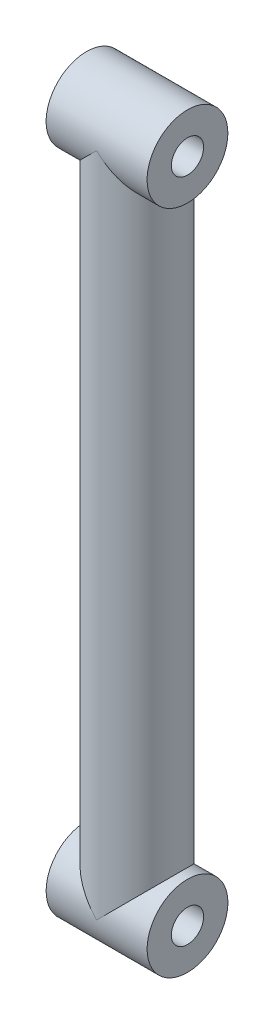
ISO-10303-21;
HEADER;
FILE_DESCRIPTION(('STEP AP214'),'2;1');
FILE_NAME('part.step','',(''),(''),'','','');
FILE_SCHEMA(('AUTOMOTIVE_DESIGN { 1 0 10303 214 1 1 1 1 }'));
ENDSEC;
DATA;
#1=APPLICATION_CONTEXT('core data for automotive mechanical design processes');
#2=APPLICATION_PROTOCOL_DEFINITION('international standard','automotive_design',2000,#1);
#3=PRODUCT_CONTEXT('',#1,'mechanical');
#4=PRODUCT('Part','Part','',(#3));
#5=PRODUCT_RELATED_PRODUCT_CATEGORY('part','',(#4));
#6=PRODUCT_DEFINITION_FORMATION('','',#4);
#7=PRODUCT_DEFINITION_CONTEXT('part definition',#1,'design');
#8=PRODUCT_DEFINITION('design','',#6,#7);
#9=PRODUCT_DEFINITION_SHAPE('','',#8);
#10=(LENGTH_UNIT() NAMED_UNIT(*) SI_UNIT(.MILLI.,.METRE.));
#11=(NAMED_UNIT(*) PLANE_ANGLE_UNIT() SI_UNIT($,.RADIAN.));
#12=(NAMED_UNIT(*) SI_UNIT($,.STERADIAN.) SOLID_ANGLE_UNIT());
#13=UNCERTAINTY_MEASURE_WITH_UNIT(LENGTH_MEASURE(1.E-05),#10,'distance_accuracy_value','');
#14=(GEOMETRIC_REPRESENTATION_CONTEXT(3) GLOBAL_UNCERTAINTY_ASSIGNED_CONTEXT((#13)) GLOBAL_UNIT_ASSIGNED_CONTEXT((#10,
#11,#12)) REPRESENTATION_CONTEXT('',''));
#15=CARTESIAN_POINT('',(0.,0.,0.));
#16=DIRECTION('',(0.,0.,1.));
#17=DIRECTION('',(1.,0.,0.));
#18=AXIS2_PLACEMENT_3D('',#15,#16,#17);
#19=CARTESIAN_POINT('',(0.,165.,0.));
#20=DIRECTION('',(0.,-1.,0.));
#21=DIRECTION('',(0.,0.,-1.));
#22=AXIS2_PLACEMENT_3D('',#19,#20,#21);
#23=CYLINDRICAL_SURFACE('',#22,10.);
#24=CARTESIAN_POINT('',(0.,165.,0.));
#25=DIRECTION('',(-0.707106781186547,-0.707106781186547,0.));
#26=DIRECTION('',(0.707106781186547,-0.707106781186547,0.));
#27=AXIS2_PLACEMENT_3D('',#24,#25,#26);
#28=ELLIPSE('',#27,14.1421356237308,9.99999999999988);
#29=CARTESIAN_POINT('',(0.,165.,-9.99999999999977));
#30=VERTEX_POINT('',#29);
#31=CARTESIAN_POINT('',(0.,165.,9.99999999999977));
#32=VERTEX_POINT('',#31);
#33=EDGE_CURVE('E51',#30,#32,#28,.T.);
#34=ORIENTED_EDGE('',*,*,#33,.T.);
#35=CARTESIAN_POINT('',(0.,165.,0.));
#36=DIRECTION('',(0.707106781186547,-0.707106781186547,0.));
#37=DIRECTION('',(-0.707106781186547,-0.707106781186547,0.));
#38=AXIS2_PLACEMENT_3D('',#35,#36,#37);
#39=ELLIPSE('',#38,14.1421356237308,9.99999999999988);
#40=EDGE_CURVE('E11',#32,#30,#39,.T.);
#41=ORIENTED_EDGE('',*,*,#40,.T.);
#42=EDGE_LOOP('',(#34,#41));
#43=FACE_BOUND('',#42,.T.);
#44=CARTESIAN_POINT('',(0.,0.,0.));
#45=DIRECTION('',(-0.707106781186547,-0.707106781186547,0.));
#46=DIRECTION('',(0.707106781186547,-0.707106781186547,0.));
#47=AXIS2_PLACEMENT_3D('',#44,#45,#46);
#48=ELLIPSE('',#47,14.1421356237308,9.99999999999989);
#49=CARTESIAN_POINT('',(0.,0.,-9.99999999999978));
#50=VERTEX_POINT('',#49);
#51=CARTESIAN_POINT('',(0.,0.,9.99999999999978));
#52=VERTEX_POINT('',#51);
#53=EDGE_CURVE('E67',#50,#52,#48,.F.);
#54=ORIENTED_EDGE('',*,*,#53,.T.);
#55=CARTESIAN_POINT('',(0.,0.,0.));
#56=DIRECTION('',(0.707106781186547,-0.707106781186547,0.));
#57=DIRECTION('',(-0.707106781186547,-0.707106781186547,0.));
#58=AXIS2_PLACEMENT_3D('',#55,#56,#57);
#59=ELLIPSE('',#58,14.1421356237308,9.99999999999989);
#60=EDGE_CURVE('E57',#52,#50,#59,.F.);
#61=ORIENTED_EDGE('',*,*,#60,.T.);
#62=EDGE_LOOP('',(#54,#61));
#63=FACE_BOUND('',#62,.T.);
#64=ADVANCED_FACE('F43',(#43,#63),#23,.T.);
#65=CARTESIAN_POINT('',(-12.5,165.,0.));
#66=DIRECTION('',(1.,0.,0.));
#67=DIRECTION('',(0.,0.,-1.));
#68=AXIS2_PLACEMENT_3D('',#65,#66,#67);
#69=CYLINDRICAL_SURFACE('',#68,9.99999999999977);
#70=CARTESIAN_POINT('',(12.5,165.,0.));
#71=DIRECTION('',(1.,0.,0.));
#72=DIRECTION('',(0.,0.,-1.));
#73=AXIS2_PLACEMENT_3D('',#70,#71,#72);
#74=CIRCLE('',#73,9.99999999999977);
#75=CARTESIAN_POINT('',(12.5,165.,-9.99999999999977));
#76=VERTEX_POINT('',#75);
#77=EDGE_CURVE('E78',#76,#76,#74,.T.);
#78=ORIENTED_EDGE('',*,*,#77,.F.);
#79=EDGE_LOOP('',(#78));
#80=FACE_BOUND('',#79,.T.);
#81=CARTESIAN_POINT('',(-12.5,165.,0.));
#82=DIRECTION('',(1.,0.,0.));
#83=DIRECTION('',(0.,0.,-1.));
#84=AXIS2_PLACEMENT_3D('',#81,#82,#83);
#85=CIRCLE('',#84,9.99999999999977);
#86=CARTESIAN_POINT('',(-12.5,165.,-9.99999999999977));
#87=VERTEX_POINT('',#86);
#88=EDGE_CURVE('E89',#87,#87,#85,.T.);
#89=ORIENTED_EDGE('',*,*,#88,.T.);
#90=EDGE_LOOP('',(#89));
#91=FACE_BOUND('',#90,.T.);
#92=ORIENTED_EDGE('',*,*,#40,.F.);
#93=ORIENTED_EDGE('',*,*,#33,.F.);
#94=EDGE_LOOP('',(#92,#93));
#95=FACE_BOUND('',#94,.T.);
#96=ADVANCED_FACE('F94',(#80,#91,#95),#69,.T.);
#97=CARTESIAN_POINT('',(-12.5,165.,0.));
#98=DIRECTION('',(1.,0.,0.));
#99=DIRECTION('',(0.,0.,-1.));
#100=AXIS2_PLACEMENT_3D('',#97,#98,#99);
#101=PLANE('',#100);
#102=CARTESIAN_POINT('',(-12.5,165.,0.));
#103=DIRECTION('',(1.,0.,0.));
#104=DIRECTION('',(0.,0.,-1.));
#105=AXIS2_PLACEMENT_3D('',#102,#103,#104);
#106=CIRCLE('',#105,4.);
#107=CARTESIAN_POINT('',(-12.5,165.,-4.));
#108=VERTEX_POINT('',#107);
#109=EDGE_CURVE('E85',#108,#108,#106,.T.);
#110=ORIENTED_EDGE('',*,*,#109,.T.);
#111=EDGE_LOOP('',(#110));
#112=FACE_BOUND('',#111,.T.);
#113=ORIENTED_EDGE('',*,*,#88,.F.);
#114=EDGE_LOOP('',(#113));
#115=FACE_BOUND('',#114,.T.);
#116=ADVANCED_FACE('F96',(#112,#115),#101,.F.);
#117=CARTESIAN_POINT('',(-12.5,165.,0.));
#118=DIRECTION('',(1.,0.,0.));
#119=DIRECTION('',(0.,0.,-1.));
#120=AXIS2_PLACEMENT_3D('',#117,#118,#119);
#121=CYLINDRICAL_SURFACE('',#120,4.);
#122=ORIENTED_EDGE('',*,*,#109,.F.);
#123=EDGE_LOOP('',(#122));
#124=FACE_BOUND('',#123,.T.);
#125=CARTESIAN_POINT('',(12.5,165.,0.));
#126=DIRECTION('',(1.,0.,0.));
#127=DIRECTION('',(0.,0.,-1.));
#128=AXIS2_PLACEMENT_3D('',#125,#126,#127);
#129=CIRCLE('',#128,4.);
#130=CARTESIAN_POINT('',(12.5,165.,-4.));
#131=VERTEX_POINT('',#130);
#132=EDGE_CURVE('E74',#131,#131,#129,.T.);
#133=ORIENTED_EDGE('',*,*,#132,.T.);
#134=EDGE_LOOP('',(#133));
#135=FACE_BOUND('',#134,.T.);
#136=ADVANCED_FACE('F102',(#124,#135),#121,.F.);
#137=CARTESIAN_POINT('',(12.5,165.,0.));
#138=DIRECTION('',(1.,0.,0.));
#139=DIRECTION('',(0.,0.,-1.));
#140=AXIS2_PLACEMENT_3D('',#137,#138,#139);
#141=PLANE('',#140);
#142=ORIENTED_EDGE('',*,*,#77,.T.);
#143=EDGE_LOOP('',(#142));
#144=FACE_BOUND('',#143,.T.);
#145=ORIENTED_EDGE('',*,*,#132,.F.);
#146=EDGE_LOOP('',(#145));
#147=FACE_BOUND('',#146,.T.);
#148=ADVANCED_FACE('F110',(#144,#147),#141,.T.);
#149=CARTESIAN_POINT('',(-12.5,0.,0.));
#150=DIRECTION('',(1.,0.,0.));
#151=DIRECTION('',(0.,0.,-1.));
#152=AXIS2_PLACEMENT_3D('',#149,#150,#151);
#153=CYLINDRICAL_SURFACE('',#152,9.99999999999978);
#154=CARTESIAN_POINT('',(12.5,0.,0.));
#155=DIRECTION('',(1.,0.,0.));
#156=DIRECTION('',(0.,0.,1.));
#157=AXIS2_PLACEMENT_3D('',#154,#155,#156);
#158=CIRCLE('',#157,9.99999999999978);
#159=CARTESIAN_POINT('',(12.5,0.,9.99999999999978));
#160=VERTEX_POINT('',#159);
#161=EDGE_CURVE('E134',#160,#160,#158,.T.);
#162=ORIENTED_EDGE('',*,*,#161,.F.);
#163=EDGE_LOOP('',(#162));
#164=FACE_BOUND('',#163,.T.);
#165=CARTESIAN_POINT('',(-12.5,0.,0.));
#166=DIRECTION('',(1.,0.,0.));
#167=DIRECTION('',(0.,0.,1.));
#168=AXIS2_PLACEMENT_3D('',#165,#166,#167);
#169=CIRCLE('',#168,9.99999999999978);
#170=CARTESIAN_POINT('',(-12.5,0.,9.99999999999978));
#171=VERTEX_POINT('',#170);
#172=EDGE_CURVE('E137',#171,#171,#169,.T.);
#173=ORIENTED_EDGE('',*,*,#172,.T.);
#174=EDGE_LOOP('',(#173));
#175=FACE_BOUND('',#174,.T.);
#176=ORIENTED_EDGE('',*,*,#60,.F.);
#177=ORIENTED_EDGE('',*,*,#53,.F.);
#178=EDGE_LOOP('',(#176,#177));
#179=FACE_BOUND('',#178,.T.);
#180=ADVANCED_FACE('F68',(#164,#175,#179),#153,.T.);
#181=CARTESIAN_POINT('',(-12.5,0.,0.));
#182=DIRECTION('',(1.,0.,0.));
#183=DIRECTION('',(0.,0.,-1.));
#184=AXIS2_PLACEMENT_3D('',#181,#182,#183);
#185=CYLINDRICAL_SURFACE('',#184,4.);
#186=CARTESIAN_POINT('',(-12.5,0.,0.));
#187=DIRECTION('',(1.,0.,0.));
#188=DIRECTION('',(0.,0.,1.));
#189=AXIS2_PLACEMENT_3D('',#186,#187,#188);
#190=CIRCLE('',#189,4.);
#191=CARTESIAN_POINT('',(-12.5,0.,4.));
#192=VERTEX_POINT('',#191);
#193=EDGE_CURVE('E140',#192,#192,#190,.T.);
#194=ORIENTED_EDGE('',*,*,#193,.F.);
#195=EDGE_LOOP('',(#194));
#196=FACE_BOUND('',#195,.T.);
#197=CARTESIAN_POINT('',(12.5,0.,0.));
#198=DIRECTION('',(1.,0.,0.));
#199=DIRECTION('',(0.,0.,1.));
#200=AXIS2_PLACEMENT_3D('',#197,#198,#199);
#201=CIRCLE('',#200,4.);
#202=CARTESIAN_POINT('',(12.5,0.,4.));
#203=VERTEX_POINT('',#202);
#204=EDGE_CURVE('E71',#203,#203,#201,.T.);
#205=ORIENTED_EDGE('',*,*,#204,.T.);
#206=EDGE_LOOP('',(#205));
#207=FACE_BOUND('',#206,.T.);
#208=ADVANCED_FACE('F120',(#196,#207),#185,.F.);
#209=CARTESIAN_POINT('',(-12.5,0.,0.));
#210=DIRECTION('',(-1.,0.,0.));
#211=DIRECTION('',(0.,0.,1.));
#212=AXIS2_PLACEMENT_3D('',#209,#210,#211);
#213=PLANE('',#212);
#214=ORIENTED_EDGE('',*,*,#193,.T.);
#215=EDGE_LOOP('',(#214));
#216=FACE_BOUND('',#215,.T.);
#217=ORIENTED_EDGE('',*,*,#172,.F.);
#218=EDGE_LOOP('',(#217));
#219=FACE_BOUND('',#218,.T.);
#220=ADVANCED_FACE('F118',(#216,#219),#213,.T.);
#221=CARTESIAN_POINT('',(12.5,0.,0.));
#222=DIRECTION('',(-1.,0.,0.));
#223=DIRECTION('',(0.,0.,1.));
#224=AXIS2_PLACEMENT_3D('',#221,#222,#223);
#225=PLANE('',#224);
#226=ORIENTED_EDGE('',*,*,#161,.T.);
#227=EDGE_LOOP('',(#226));
#228=FACE_BOUND('',#227,.T.);
#229=ORIENTED_EDGE('',*,*,#204,.F.);
#230=EDGE_LOOP('',(#229));
#231=FACE_BOUND('',#230,.T.);
#232=ADVANCED_FACE('F115',(#228,#231),#225,.F.);
#233=CLOSED_SHELL('',(#64,#96,#116,#136,#148,#180,#208,#220,#232));
#234=MANIFOLD_SOLID_BREP('B2',#233);
#235=ADVANCED_BREP_SHAPE_REPRESENTATION('',(#18,#234),#14);
#236=SHAPE_DEFINITION_REPRESENTATION(#9,#235);
ENDSEC;
END-ISO-10303-21;
